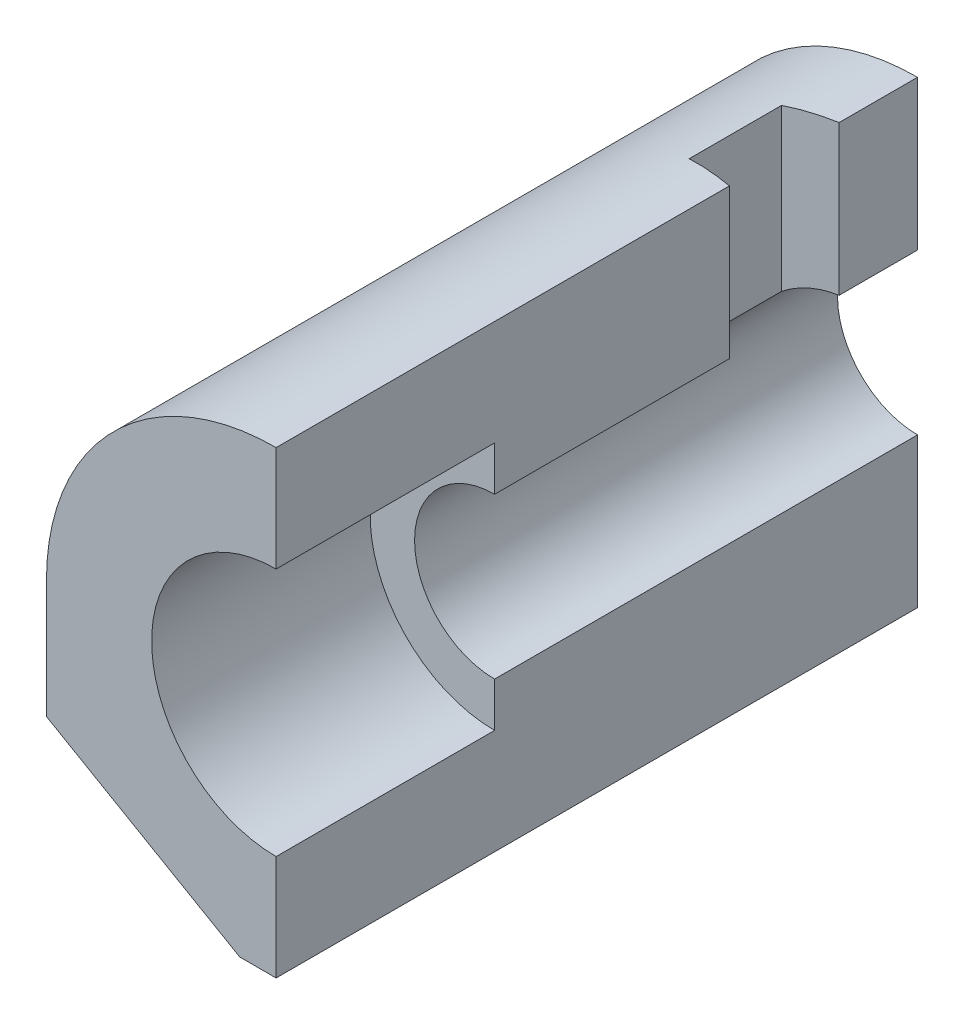
ISO-10303-21;
HEADER;
FILE_DESCRIPTION(('STEP AP214'),'2;1');
FILE_NAME('part.step','',(''),(''),'','','');
FILE_SCHEMA(('AUTOMOTIVE_DESIGN { 1 0 10303 214 1 1 1 1 }'));
ENDSEC;
DATA;
#1=APPLICATION_CONTEXT('core data for automotive mechanical design processes');
#2=APPLICATION_PROTOCOL_DEFINITION('international standard','automotive_design',2000,#1);
#3=PRODUCT_CONTEXT('',#1,'mechanical');
#4=PRODUCT('Part','Part','',(#3));
#5=PRODUCT_RELATED_PRODUCT_CATEGORY('part','',(#4));
#6=PRODUCT_DEFINITION_FORMATION('','',#4);
#7=PRODUCT_DEFINITION_CONTEXT('part definition',#1,'design');
#8=PRODUCT_DEFINITION('design','',#6,#7);
#9=PRODUCT_DEFINITION_SHAPE('','',#8);
#10=(LENGTH_UNIT() NAMED_UNIT(*) SI_UNIT(.MILLI.,.METRE.));
#11=(NAMED_UNIT(*) PLANE_ANGLE_UNIT() SI_UNIT($,.RADIAN.));
#12=(NAMED_UNIT(*) SI_UNIT($,.STERADIAN.) SOLID_ANGLE_UNIT());
#13=UNCERTAINTY_MEASURE_WITH_UNIT(LENGTH_MEASURE(1.E-05),#10,'distance_accuracy_value','');
#14=(GEOMETRIC_REPRESENTATION_CONTEXT(3) GLOBAL_UNCERTAINTY_ASSIGNED_CONTEXT((#13)) GLOBAL_UNIT_ASSIGNED_CONTEXT((#10,
#11,#12)) REPRESENTATION_CONTEXT('',''));
#15=CARTESIAN_POINT('',(0.,0.,0.));
#16=DIRECTION('',(0.,0.,1.));
#17=DIRECTION('',(1.,0.,0.));
#18=AXIS2_PLACEMENT_3D('',#15,#16,#17);
#19=CARTESIAN_POINT('',(0.,0.,229.));
#20=DIRECTION('',(-1.,0.,0.));
#21=DIRECTION('',(0.,0.,1.));
#22=AXIS2_PLACEMENT_3D('',#19,#20,#21);
#23=PLANE('',#22);
#24=DIRECTION('',(0.,0.,-1.));
#25=VECTOR('',#24,1.);
#26=CARTESIAN_POINT('',(0.,164.,229.));
#27=LINE('',#26,#25);
#28=CARTESIAN_POINT('',(0.,164.,28.0000000000001));
#29=VERTEX_POINT('',#28);
#30=CARTESIAN_POINT('',(0.,164.,0.));
#31=VERTEX_POINT('',#30);
#32=EDGE_CURVE('E255',#29,#31,#27,.T.);
#33=ORIENTED_EDGE('',*,*,#32,.F.);
#34=DIRECTION('',(0.,1.,0.));
#35=VECTOR('',#34,1.);
#36=CARTESIAN_POINT('',(0.,-0.001000000000001,28.));
#37=LINE('',#36,#35);
#38=CARTESIAN_POINT('',(0.,110.575,28.));
#39=VERTEX_POINT('',#38);
#40=EDGE_CURVE('E162',#39,#29,#37,.T.);
#41=ORIENTED_EDGE('',*,*,#40,.F.);
#42=DIRECTION('',(0.,0.,1.));
#43=VECTOR('',#42,1.);
#44=CARTESIAN_POINT('',(0.,110.575,0.));
#45=LINE('',#44,#43);
#46=CARTESIAN_POINT('',(0.,110.575,0.));
#47=VERTEX_POINT('',#46);
#48=EDGE_CURVE('E183',#39,#47,#45,.F.);
#49=ORIENTED_EDGE('',*,*,#48,.T.);
#50=DIRECTION('',(0.,1.,0.));
#51=VECTOR('',#50,1.);
#52=CARTESIAN_POINT('',(0.,0.,0.));
#53=LINE('',#52,#51);
#54=EDGE_CURVE('E231',#47,#31,#53,.T.);
#55=ORIENTED_EDGE('',*,*,#54,.T.);
#56=EDGE_LOOP('',(#33,#41,#49,#55));
#57=FACE_BOUND('',#56,.T.);
#58=ADVANCED_FACE('F39',(#57),#23,.F.);
#59=CARTESIAN_POINT('',(0.,0.,0.));
#60=VERTEX_POINT('',#59);
#61=CARTESIAN_POINT('',(0.,53.425,0.));
#62=VERTEX_POINT('',#61);
#63=EDGE_CURVE('E232',#60,#62,#53,.T.);
#64=ORIENTED_EDGE('',*,*,#63,.T.);
#65=DIRECTION('',(0.,0.,1.));
#66=VECTOR('',#65,1.);
#67=CARTESIAN_POINT('',(0.,53.425,0.));
#68=LINE('',#67,#66);
#69=CARTESIAN_POINT('',(0.,53.425,151.));
#70=VERTEX_POINT('',#69);
#71=EDGE_CURVE('E188',#62,#70,#68,.T.);
#72=ORIENTED_EDGE('',*,*,#71,.T.);
#73=DIRECTION('',(0.,1.,0.));
#74=VECTOR('',#73,1.);
#75=CARTESIAN_POINT('',(0.,0.,151.));
#76=LINE('',#75,#74);
#77=CARTESIAN_POINT('',(0.,37.55,151.));
#78=VERTEX_POINT('',#77);
#79=EDGE_CURVE('E11',#78,#70,#76,.T.);
#80=ORIENTED_EDGE('',*,*,#79,.F.);
#81=DIRECTION('',(0.,0.,1.));
#82=VECTOR('',#81,1.);
#83=CARTESIAN_POINT('',(0.,37.55,151.));
#84=LINE('',#83,#82);
#85=CARTESIAN_POINT('',(0.,37.55,229.));
#86=VERTEX_POINT('',#85);
#87=EDGE_CURVE('E203',#78,#86,#84,.T.);
#88=ORIENTED_EDGE('',*,*,#87,.T.);
#89=DIRECTION('',(0.,1.,0.));
#90=VECTOR('',#89,1.);
#91=CARTESIAN_POINT('',(0.,0.,229.));
#92=LINE('',#91,#90);
#93=CARTESIAN_POINT('',(0.,0.,229.));
#94=VERTEX_POINT('',#93);
#95=EDGE_CURVE('E214',#94,#86,#92,.T.);
#96=ORIENTED_EDGE('',*,*,#95,.F.);
#97=DIRECTION('',(0.,0.,-1.));
#98=VECTOR('',#97,1.);
#99=CARTESIAN_POINT('',(0.,0.,229.));
#100=LINE('',#99,#98);
#101=EDGE_CURVE('E257',#94,#60,#100,.T.);
#102=ORIENTED_EDGE('',*,*,#101,.T.);
#103=EDGE_LOOP('',(#64,#72,#80,#88,#96,#102));
#104=FACE_BOUND('',#103,.T.);
#105=ADVANCED_FACE('F309',(#104),#23,.F.);
#106=CARTESIAN_POINT('',(-13.,0.,229.));
#107=DIRECTION('',(0.,1.,0.));
#108=DIRECTION('',(0.,0.,1.));
#109=AXIS2_PLACEMENT_3D('',#106,#107,#108);
#110=PLANE('',#109);
#111=DIRECTION('',(1.,0.,0.));
#112=VECTOR('',#111,1.);
#113=CARTESIAN_POINT('',(-13.,0.,0.));
#114=LINE('',#113,#112);
#115=CARTESIAN_POINT('',(-13.,0.,0.));
#116=VERTEX_POINT('',#115);
#117=EDGE_CURVE('E207',#116,#60,#114,.T.);
#118=ORIENTED_EDGE('',*,*,#117,.T.);
#119=ORIENTED_EDGE('',*,*,#101,.F.);
#120=DIRECTION('',(1.,0.,0.));
#121=VECTOR('',#120,1.);
#122=CARTESIAN_POINT('',(-13.,0.,229.));
#123=LINE('',#122,#121);
#124=CARTESIAN_POINT('',(-13.,0.,229.));
#125=VERTEX_POINT('',#124);
#126=EDGE_CURVE('E208',#125,#94,#123,.T.);
#127=ORIENTED_EDGE('',*,*,#126,.F.);
#128=DIRECTION('',(0.,0.,-1.));
#129=VECTOR('',#128,1.);
#130=CARTESIAN_POINT('',(-13.,0.,229.));
#131=LINE('',#130,#129);
#132=EDGE_CURVE('E227',#125,#116,#131,.T.);
#133=ORIENTED_EDGE('',*,*,#132,.T.);
#134=EDGE_LOOP('',(#118,#119,#127,#133));
#135=FACE_BOUND('',#134,.T.);
#136=ADVANCED_FACE('F41',(#135),#110,.F.);
#137=CARTESIAN_POINT('',(0.,110.575,151.));
#138=VERTEX_POINT('',#137);
#139=CARTESIAN_POINT('',(0.,110.575,67.1591927355822));
#140=VERTEX_POINT('',#139);
#141=EDGE_CURVE('E62',#138,#140,#45,.F.);
#142=ORIENTED_EDGE('',*,*,#141,.T.);
#143=DIRECTION('',(0.,1.,0.));
#144=VECTOR('',#143,1.);
#145=CARTESIAN_POINT('',(0.,-0.001000000000001,67.1591927355822));
#146=LINE('',#145,#144);
#147=CARTESIAN_POINT('',(0.,164.,67.1591927355822));
#148=VERTEX_POINT('',#147);
#149=EDGE_CURVE('E55',#140,#148,#146,.T.);
#150=ORIENTED_EDGE('',*,*,#149,.T.);
#151=CARTESIAN_POINT('',(0.,164.,229.));
#152=VERTEX_POINT('',#151);
#153=EDGE_CURVE('E157',#152,#148,#27,.T.);
#154=ORIENTED_EDGE('',*,*,#153,.F.);
#155=CARTESIAN_POINT('',(0.,126.45,229.));
#156=VERTEX_POINT('',#155);
#157=EDGE_CURVE('E212',#156,#152,#92,.T.);
#158=ORIENTED_EDGE('',*,*,#157,.F.);
#159=DIRECTION('',(0.,0.,1.));
#160=VECTOR('',#159,1.);
#161=CARTESIAN_POINT('',(0.,126.45,151.));
#162=LINE('',#161,#160);
#163=CARTESIAN_POINT('',(0.,126.45,151.));
#164=VERTEX_POINT('',#163);
#165=EDGE_CURVE('E197',#156,#164,#162,.F.);
#166=ORIENTED_EDGE('',*,*,#165,.T.);
#167=EDGE_CURVE('E48',#138,#164,#76,.T.);
#168=ORIENTED_EDGE('',*,*,#167,.F.);
#169=EDGE_LOOP('',(#142,#150,#154,#158,#166,#168));
#170=FACE_BOUND('',#169,.T.);
#171=ADVANCED_FACE('F273',(#170),#23,.F.);
#172=CARTESIAN_POINT('',(0.,82.,229.));
#173=DIRECTION('',(0.,0.,-1.));
#174=DIRECTION('',(-1.,0.,0.));
#175=AXIS2_PLACEMENT_3D('',#172,#173,#174);
#176=CYLINDRICAL_SURFACE('',#175,82.);
#177=DIRECTION('',(0.,0.,-1.));
#178=VECTOR('',#177,1.);
#179=CARTESIAN_POINT('',(-17.4652588924144,162.118441895864,229.));
#180=LINE('',#179,#178);
#181=CARTESIAN_POINT('',(-17.4652588924144,162.118441895864,31.0795963677911));
#182=VERTEX_POINT('',#181);
#183=CARTESIAN_POINT('',(-17.4652588924144,162.118441895864,64.0795963677911));
#184=VERTEX_POINT('',#183);
#185=EDGE_CURVE('E146',#182,#184,#180,.F.);
#186=ORIENTED_EDGE('',*,*,#185,.F.);
#187=CARTESIAN_POINT('',(0.,82.,28.));
#188=DIRECTION('',(-0.173648177666931,0.,-0.984807753012208));
#189=DIRECTION('',(0.984807753012208,0.,-0.173648177666931));
#190=AXIS2_PLACEMENT_3D('',#187,#188,#189);
#191=ELLIPSE('',#190,83.2649821746311,82.);
#192=EDGE_CURVE('E159',#29,#182,#191,.F.);
#193=ORIENTED_EDGE('',*,*,#192,.F.);
#194=ORIENTED_EDGE('',*,*,#32,.T.);
#195=CARTESIAN_POINT('',(0.,82.,0.));
#196=DIRECTION('',(0.,0.,1.));
#197=DIRECTION('',(1.,0.,0.));
#198=AXIS2_PLACEMENT_3D('',#195,#196,#197);
#199=CIRCLE('',#198,82.);
#200=CARTESIAN_POINT('',(-82.,82.,0.));
#201=VERTEX_POINT('',#200);
#202=EDGE_CURVE('E236',#31,#201,#199,.T.);
#203=ORIENTED_EDGE('',*,*,#202,.T.);
#204=DIRECTION('',(0.,0.,-1.));
#205=VECTOR('',#204,1.);
#206=CARTESIAN_POINT('',(-82.,82.,229.));
#207=LINE('',#206,#205);
#208=CARTESIAN_POINT('',(-82.,82.,229.));
#209=VERTEX_POINT('',#208);
#210=EDGE_CURVE('E251',#209,#201,#207,.T.);
#211=ORIENTED_EDGE('',*,*,#210,.F.);
#212=CARTESIAN_POINT('',(0.,82.,229.));
#213=DIRECTION('',(0.,0.,1.));
#214=DIRECTION('',(1.,0.,0.));
#215=AXIS2_PLACEMENT_3D('',#212,#213,#214);
#216=CIRCLE('',#215,82.);
#217=EDGE_CURVE('E218',#152,#209,#216,.T.);
#218=ORIENTED_EDGE('',*,*,#217,.F.);
#219=ORIENTED_EDGE('',*,*,#153,.T.);
#220=CARTESIAN_POINT('',(0.,82.,67.1591927355822));
#221=DIRECTION('',(-0.173648177666931,0.,0.984807753012208));
#222=DIRECTION('',(-0.984807753012208,0.,-0.173648177666931));
#223=AXIS2_PLACEMENT_3D('',#220,#221,#222);
#224=ELLIPSE('',#223,83.2649821746311,82.);
#225=EDGE_CURVE('E137',#184,#148,#224,.F.);
#226=ORIENTED_EDGE('',*,*,#225,.F.);
#227=EDGE_LOOP('',(#186,#193,#194,#203,#211,#218,#219,#226));
#228=FACE_BOUND('',#227,.T.);
#229=ADVANCED_FACE('F154',(#228),#176,.T.);
#230=CARTESIAN_POINT('',(-82.,82.,229.));
#231=DIRECTION('',(1.,0.,0.));
#232=DIRECTION('',(0.,1.,0.));
#233=AXIS2_PLACEMENT_3D('',#230,#231,#232);
#234=PLANE('',#233);
#235=DIRECTION('',(0.,-1.,0.));
#236=VECTOR('',#235,1.);
#237=CARTESIAN_POINT('',(-82.,82.,0.));
#238=LINE('',#237,#236);
#239=CARTESIAN_POINT('',(-82.,39.8371685740843,0.));
#240=VERTEX_POINT('',#239);
#241=EDGE_CURVE('E239',#201,#240,#238,.T.);
#242=ORIENTED_EDGE('',*,*,#241,.T.);
#243=DIRECTION('',(0.,0.,-1.));
#244=VECTOR('',#243,1.);
#245=CARTESIAN_POINT('',(-82.,39.8371685740843,229.));
#246=LINE('',#245,#244);
#247=CARTESIAN_POINT('',(-82.,39.8371685740843,229.));
#248=VERTEX_POINT('',#247);
#249=EDGE_CURVE('E247',#248,#240,#246,.T.);
#250=ORIENTED_EDGE('',*,*,#249,.F.);
#251=DIRECTION('',(0.,-1.,0.));
#252=VECTOR('',#251,1.);
#253=CARTESIAN_POINT('',(-82.,82.,229.));
#254=LINE('',#253,#252);
#255=EDGE_CURVE('E221',#209,#248,#254,.T.);
#256=ORIENTED_EDGE('',*,*,#255,.F.);
#257=ORIENTED_EDGE('',*,*,#210,.T.);
#258=EDGE_LOOP('',(#242,#250,#256,#257));
#259=FACE_BOUND('',#258,.T.);
#260=ADVANCED_FACE('F297',(#259),#234,.F.);
#261=CARTESIAN_POINT('',(-82.,39.8371685740843,229.));
#262=DIRECTION('',(0.500000000000001,0.866025403784438,0.));
#263=DIRECTION('',(-0.866025403784438,0.500000000000001,0.));
#264=AXIS2_PLACEMENT_3D('',#261,#262,#263);
#265=PLANE('',#264);
#266=DIRECTION('',(0.866025403784438,-0.500000000000001,0.));
#267=VECTOR('',#266,1.);
#268=CARTESIAN_POINT('',(-82.,39.8371685740843,0.));
#269=LINE('',#268,#267);
#270=EDGE_CURVE('E213',#240,#116,#269,.T.);
#271=ORIENTED_EDGE('',*,*,#270,.T.);
#272=ORIENTED_EDGE('',*,*,#132,.F.);
#273=DIRECTION('',(0.866025403784438,-0.500000000000001,0.));
#274=VECTOR('',#273,1.);
#275=CARTESIAN_POINT('',(-82.,39.8371685740843,229.));
#276=LINE('',#275,#274);
#277=EDGE_CURVE('E224',#248,#125,#276,.T.);
#278=ORIENTED_EDGE('',*,*,#277,.F.);
#279=ORIENTED_EDGE('',*,*,#249,.T.);
#280=EDGE_LOOP('',(#271,#272,#278,#279));
#281=FACE_BOUND('',#280,.T.);
#282=ADVANCED_FACE('F304',(#281),#265,.F.);
#283=CARTESIAN_POINT('',(0.,82.,229.));
#284=DIRECTION('',(0.,0.,1.));
#285=DIRECTION('',(1.,0.,0.));
#286=AXIS2_PLACEMENT_3D('',#283,#284,#285);
#287=PLANE('',#286);
#288=CARTESIAN_POINT('',(0.,82.,229.));
#289=DIRECTION('',(0.,0.,1.));
#290=DIRECTION('',(1.,0.,0.));
#291=AXIS2_PLACEMENT_3D('',#288,#289,#290);
#292=CIRCLE('',#291,44.45);
#293=EDGE_CURVE('E192',#156,#86,#292,.T.);
#294=ORIENTED_EDGE('',*,*,#293,.F.);
#295=ORIENTED_EDGE('',*,*,#157,.T.);
#296=ORIENTED_EDGE('',*,*,#217,.T.);
#297=ORIENTED_EDGE('',*,*,#255,.T.);
#298=ORIENTED_EDGE('',*,*,#277,.T.);
#299=ORIENTED_EDGE('',*,*,#126,.T.);
#300=ORIENTED_EDGE('',*,*,#95,.T.);
#301=EDGE_LOOP('',(#294,#295,#296,#297,#298,#299,#300));
#302=FACE_BOUND('',#301,.T.);
#303=ADVANCED_FACE('F308',(#302),#287,.T.);
#304=CARTESIAN_POINT('',(0.,82.,0.));
#305=DIRECTION('',(0.,0.,1.));
#306=DIRECTION('',(1.,0.,0.));
#307=AXIS2_PLACEMENT_3D('',#304,#305,#306);
#308=PLANE('',#307);
#309=ORIENTED_EDGE('',*,*,#54,.F.);
#310=CARTESIAN_POINT('',(0.,82.,0.));
#311=DIRECTION('',(0.,0.,1.));
#312=DIRECTION('',(1.,0.,0.));
#313=AXIS2_PLACEMENT_3D('',#310,#311,#312);
#314=CIRCLE('',#313,28.575);
#315=EDGE_CURVE('E179',#47,#62,#314,.T.);
#316=ORIENTED_EDGE('',*,*,#315,.T.);
#317=ORIENTED_EDGE('',*,*,#63,.F.);
#318=ORIENTED_EDGE('',*,*,#117,.F.);
#319=ORIENTED_EDGE('',*,*,#270,.F.);
#320=ORIENTED_EDGE('',*,*,#241,.F.);
#321=ORIENTED_EDGE('',*,*,#202,.F.);
#322=EDGE_LOOP('',(#309,#316,#317,#318,#319,#320,#321));
#323=FACE_BOUND('',#322,.T.);
#324=ADVANCED_FACE('F300',(#323),#308,.F.);
#325=CARTESIAN_POINT('',(0.,82.,151.));
#326=DIRECTION('',(0.,0.,1.));
#327=DIRECTION('',(1.,0.,0.));
#328=AXIS2_PLACEMENT_3D('',#325,#326,#327);
#329=PLANE('',#328);
#330=CARTESIAN_POINT('',(0.,82.,151.));
#331=DIRECTION('',(0.,0.,1.));
#332=DIRECTION('',(1.,0.,0.));
#333=AXIS2_PLACEMENT_3D('',#330,#331,#332);
#334=CIRCLE('',#333,28.575);
#335=EDGE_CURVE('E170',#138,#70,#334,.T.);
#336=ORIENTED_EDGE('',*,*,#335,.F.);
#337=ORIENTED_EDGE('',*,*,#167,.T.);
#338=CARTESIAN_POINT('',(0.,82.,151.));
#339=DIRECTION('',(0.,0.,1.));
#340=DIRECTION('',(1.,0.,0.));
#341=AXIS2_PLACEMENT_3D('',#338,#339,#340);
#342=CIRCLE('',#341,44.45);
#343=EDGE_CURVE('E193',#164,#78,#342,.T.);
#344=ORIENTED_EDGE('',*,*,#343,.T.);
#345=ORIENTED_EDGE('',*,*,#79,.T.);
#346=EDGE_LOOP('',(#336,#337,#344,#345));
#347=FACE_BOUND('',#346,.T.);
#348=ADVANCED_FACE('F266',(#347),#329,.T.);
#349=CARTESIAN_POINT('',(0.,82.,151.));
#350=DIRECTION('',(0.,0.,1.));
#351=DIRECTION('',(1.,0.,0.));
#352=AXIS2_PLACEMENT_3D('',#349,#350,#351);
#353=CYLINDRICAL_SURFACE('',#352,44.45);
#354=ORIENTED_EDGE('',*,*,#343,.F.);
#355=ORIENTED_EDGE('',*,*,#165,.F.);
#356=ORIENTED_EDGE('',*,*,#293,.T.);
#357=ORIENTED_EDGE('',*,*,#87,.F.);
#358=EDGE_LOOP('',(#354,#355,#356,#357));
#359=FACE_BOUND('',#358,.T.);
#360=ADVANCED_FACE('F270',(#359),#353,.F.);
#361=CARTESIAN_POINT('',(0.,82.,0.));
#362=DIRECTION('',(0.,0.,1.));
#363=DIRECTION('',(1.,0.,0.));
#364=AXIS2_PLACEMENT_3D('',#361,#362,#363);
#365=CYLINDRICAL_SURFACE('',#364,28.575);
#366=ORIENTED_EDGE('',*,*,#48,.F.);
#367=CARTESIAN_POINT('',(0.,82.,28.));
#368=DIRECTION('',(-0.173648177666931,0.,-0.984807753012208));
#369=DIRECTION('',(-0.984807753012208,0.,0.173648177666931));
#370=AXIS2_PLACEMENT_3D('',#367,#368,#369);
#371=ELLIPSE('',#370,29.0158154346352,28.575);
#372=CARTESIAN_POINT('',(-17.4652588924144,104.616263104698,31.0795963677911));
#373=VERTEX_POINT('',#372);
#374=EDGE_CURVE('E167',#373,#39,#371,.T.);
#375=ORIENTED_EDGE('',*,*,#374,.F.);
#376=DIRECTION('',(0.,0.,1.));
#377=VECTOR('',#376,1.);
#378=CARTESIAN_POINT('',(-17.4652588924144,104.616263104698,0.));
#379=LINE('',#378,#377);
#380=CARTESIAN_POINT('',(-17.4652588924144,104.616263104698,64.0795963677911));
#381=VERTEX_POINT('',#380);
#382=EDGE_CURVE('E165',#381,#373,#379,.F.);
#383=ORIENTED_EDGE('',*,*,#382,.F.);
#384=CARTESIAN_POINT('',(0.,82.,67.1591927355822));
#385=DIRECTION('',(-0.173648177666931,0.,0.984807753012208));
#386=DIRECTION('',(0.984807753012208,0.,0.173648177666931));
#387=AXIS2_PLACEMENT_3D('',#384,#385,#386);
#388=ELLIPSE('',#387,29.0158154346352,28.575);
#389=EDGE_CURVE('E138',#140,#381,#388,.T.);
#390=ORIENTED_EDGE('',*,*,#389,.F.);
#391=ORIENTED_EDGE('',*,*,#141,.F.);
#392=ORIENTED_EDGE('',*,*,#335,.T.);
#393=ORIENTED_EDGE('',*,*,#71,.F.);
#394=ORIENTED_EDGE('',*,*,#315,.F.);
#395=EDGE_LOOP('',(#366,#375,#383,#390,#391,#392,#393,#394));
#396=FACE_BOUND('',#395,.T.);
#397=ADVANCED_FACE('F282',(#396),#365,.F.);
#398=CARTESIAN_POINT('',(-17.4652588924144,-0.001000000000001,31.0795963677911));
#399=DIRECTION('',(-0.173648177666931,0.,-0.984807753012208));
#400=DIRECTION('',(-0.984807753012208,0.,0.173648177666931));
#401=AXIS2_PLACEMENT_3D('',#398,#399,#400);
#402=PLANE('',#401);
#403=ORIENTED_EDGE('',*,*,#192,.T.);
#404=DIRECTION('',(0.,1.,0.));
#405=VECTOR('',#404,1.);
#406=CARTESIAN_POINT('',(-17.4652588924144,-0.001000000000001,31.0795963677911));
#407=LINE('',#406,#405);
#408=EDGE_CURVE('E143',#373,#182,#407,.T.);
#409=ORIENTED_EDGE('',*,*,#408,.F.);
#410=ORIENTED_EDGE('',*,*,#374,.T.);
#411=ORIENTED_EDGE('',*,*,#40,.T.);
#412=EDGE_LOOP('',(#403,#409,#410,#411));
#413=FACE_BOUND('',#412,.T.);
#414=ADVANCED_FACE('F286',(#413),#402,.F.);
#415=CARTESIAN_POINT('',(-17.4652588924144,-0.001000000000001,64.0795963677911));
#416=DIRECTION('',(-1.,0.,0.));
#417=DIRECTION('',(0.,0.,1.));
#418=AXIS2_PLACEMENT_3D('',#415,#416,#417);
#419=PLANE('',#418);
#420=ORIENTED_EDGE('',*,*,#185,.T.);
#421=DIRECTION('',(0.,1.,0.));
#422=VECTOR('',#421,1.);
#423=CARTESIAN_POINT('',(-17.4652588924144,-0.001000000000001,64.0795963677911));
#424=LINE('',#423,#422);
#425=EDGE_CURVE('E133',#381,#184,#424,.T.);
#426=ORIENTED_EDGE('',*,*,#425,.F.);
#427=ORIENTED_EDGE('',*,*,#382,.T.);
#428=ORIENTED_EDGE('',*,*,#408,.T.);
#429=EDGE_LOOP('',(#420,#426,#427,#428));
#430=FACE_BOUND('',#429,.T.);
#431=ADVANCED_FACE('F147',(#430),#419,.F.);
#432=CARTESIAN_POINT('',(0.,-0.001000000000001,67.1591927355822));
#433=DIRECTION('',(-0.173648177666931,0.,0.984807753012208));
#434=DIRECTION('',(0.984807753012208,0.,0.173648177666931));
#435=AXIS2_PLACEMENT_3D('',#432,#433,#434);
#436=PLANE('',#435);
#437=ORIENTED_EDGE('',*,*,#225,.T.);
#438=ORIENTED_EDGE('',*,*,#149,.F.);
#439=ORIENTED_EDGE('',*,*,#389,.T.);
#440=ORIENTED_EDGE('',*,*,#425,.T.);
#441=EDGE_LOOP('',(#437,#438,#439,#440));
#442=FACE_BOUND('',#441,.T.);
#443=ADVANCED_FACE('F135',(#442),#436,.F.);
#444=CLOSED_SHELL('',(#58,#105,#136,#171,#229,#260,#282,#303,#324,#348,#360,#397,#414,#431,#443));
#445=MANIFOLD_SOLID_BREP('B2',#444);
#446=ADVANCED_BREP_SHAPE_REPRESENTATION('',(#18,#445),#14);
#447=SHAPE_DEFINITION_REPRESENTATION(#9,#446);
ENDSEC;
END-ISO-10303-21;
